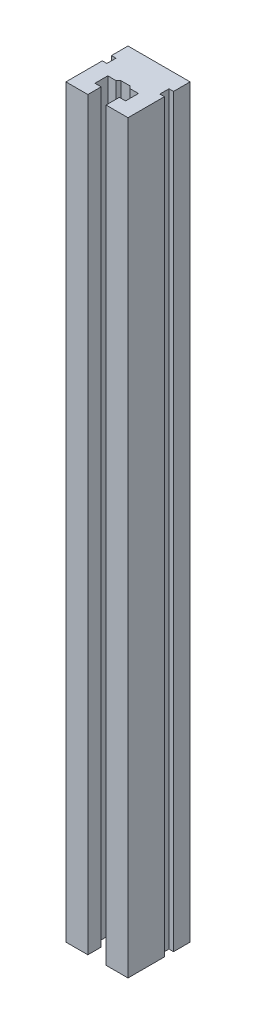
ISO-10303-21;
HEADER;
FILE_DESCRIPTION(('STEP AP214'),'2;1');
FILE_NAME('part.step','',(''),(''),'','','');
FILE_SCHEMA(('AUTOMOTIVE_DESIGN { 1 0 10303 214 1 1 1 1 }'));
ENDSEC;
DATA;
#1=APPLICATION_CONTEXT('core data for automotive mechanical design processes');
#2=APPLICATION_PROTOCOL_DEFINITION('international standard','automotive_design',2000,#1);
#3=PRODUCT_CONTEXT('',#1,'mechanical');
#4=PRODUCT('Part','Part','',(#3));
#5=PRODUCT_RELATED_PRODUCT_CATEGORY('part','',(#4));
#6=PRODUCT_DEFINITION_FORMATION('','',#4);
#7=PRODUCT_DEFINITION_CONTEXT('part definition',#1,'design');
#8=PRODUCT_DEFINITION('design','',#6,#7);
#9=PRODUCT_DEFINITION_SHAPE('','',#8);
#10=(LENGTH_UNIT() NAMED_UNIT(*) SI_UNIT(.MILLI.,.METRE.));
#11=(NAMED_UNIT(*) PLANE_ANGLE_UNIT() SI_UNIT($,.RADIAN.));
#12=(NAMED_UNIT(*) SI_UNIT($,.STERADIAN.) SOLID_ANGLE_UNIT());
#13=UNCERTAINTY_MEASURE_WITH_UNIT(LENGTH_MEASURE(1.E-05),#10,'distance_accuracy_value','');
#14=(GEOMETRIC_REPRESENTATION_CONTEXT(3) GLOBAL_UNCERTAINTY_ASSIGNED_CONTEXT((#13)) GLOBAL_UNIT_ASSIGNED_CONTEXT((#10,
#11,#12)) REPRESENTATION_CONTEXT('',''));
#15=CARTESIAN_POINT('',(0.,0.,0.));
#16=DIRECTION('',(0.,0.,1.));
#17=DIRECTION('',(1.,0.,0.));
#18=AXIS2_PLACEMENT_3D('',#15,#16,#17);
#19=CARTESIAN_POINT('',(37.5,-900.,19.9999999999997));
#20=DIRECTION('',(1.,0.,0.));
#21=DIRECTION('',(0.,0.,-1.));
#22=AXIS2_PLACEMENT_3D('',#19,#20,#21);
#23=PLANE('',#22);
#24=DIRECTION('',(0.,0.,-1.));
#25=VECTOR('',#24,1.);
#26=CARTESIAN_POINT('',(37.5,0.,19.9999999999997));
#27=LINE('',#26,#25);
#28=CARTESIAN_POINT('',(37.5,0.,19.9999999999997));
#29=VERTEX_POINT('',#28);
#30=CARTESIAN_POINT('',(37.5,0.,-2.97641118013882E-13));
#31=VERTEX_POINT('',#30);
#32=EDGE_CURVE('E244',#29,#31,#27,.T.);
#33=ORIENTED_EDGE('',*,*,#32,.F.);
#34=DIRECTION('',(0.,1.,0.));
#35=VECTOR('',#34,1.);
#36=CARTESIAN_POINT('',(37.5,-900.,19.9999999999997));
#37=LINE('',#36,#35);
#38=CARTESIAN_POINT('',(37.5,-900.,19.9999999999997));
#39=VERTEX_POINT('',#38);
#40=EDGE_CURVE('E11',#39,#29,#37,.T.);
#41=ORIENTED_EDGE('',*,*,#40,.F.);
#42=DIRECTION('',(0.,0.,-1.));
#43=VECTOR('',#42,1.);
#44=CARTESIAN_POINT('',(37.5,-900.,19.9999999999997));
#45=LINE('',#44,#43);
#46=CARTESIAN_POINT('',(37.5,-900.,-2.97641118013882E-13));
#47=VERTEX_POINT('',#46);
#48=EDGE_CURVE('E320',#39,#47,#45,.T.);
#49=ORIENTED_EDGE('',*,*,#48,.T.);
#50=DIRECTION('',(0.,1.,0.));
#51=VECTOR('',#50,1.);
#52=CARTESIAN_POINT('',(37.5,-900.,-2.97641118013882E-13));
#53=LINE('',#52,#51);
#54=EDGE_CURVE('E45',#47,#31,#53,.T.);
#55=ORIENTED_EDGE('',*,*,#54,.T.);
#56=EDGE_LOOP('',(#33,#41,#49,#55));
#57=FACE_BOUND('',#56,.T.);
#58=ADVANCED_FACE('F42',(#57),#23,.T.);
#59=CARTESIAN_POINT('',(32.,-900.,19.9999999999997));
#60=DIRECTION('',(0.,0.,1.));
#61=DIRECTION('',(1.,0.,0.));
#62=AXIS2_PLACEMENT_3D('',#59,#60,#61);
#63=PLANE('',#62);
#64=DIRECTION('',(1.,0.,0.));
#65=VECTOR('',#64,1.);
#66=CARTESIAN_POINT('',(32.,0.,19.9999999999997));
#67=LINE('',#66,#65);
#68=CARTESIAN_POINT('',(32.,0.,19.9999999999997));
#69=VERTEX_POINT('',#68);
#70=EDGE_CURVE('E318',#69,#29,#67,.T.);
#71=ORIENTED_EDGE('',*,*,#70,.F.);
#72=DIRECTION('',(0.,1.,0.));
#73=VECTOR('',#72,1.);
#74=CARTESIAN_POINT('',(32.,-900.,19.9999999999997));
#75=LINE('',#74,#73);
#76=CARTESIAN_POINT('',(32.,-900.,19.9999999999997));
#77=VERTEX_POINT('',#76);
#78=EDGE_CURVE('E52',#77,#69,#75,.T.);
#79=ORIENTED_EDGE('',*,*,#78,.F.);
#80=DIRECTION('',(1.,0.,0.));
#81=VECTOR('',#80,1.);
#82=CARTESIAN_POINT('',(32.,-900.,19.9999999999997));
#83=LINE('',#82,#81);
#84=EDGE_CURVE('E234',#77,#39,#83,.T.);
#85=ORIENTED_EDGE('',*,*,#84,.T.);
#86=ORIENTED_EDGE('',*,*,#40,.T.);
#87=EDGE_LOOP('',(#71,#79,#85,#86));
#88=FACE_BOUND('',#87,.T.);
#89=ADVANCED_FACE('F386',(#88),#63,.T.);
#90=CARTESIAN_POINT('',(32.,-900.,30.9999999999997));
#91=DIRECTION('',(1.,0.,0.));
#92=DIRECTION('',(0.,0.,-1.));
#93=AXIS2_PLACEMENT_3D('',#90,#91,#92);
#94=PLANE('',#93);
#95=DIRECTION('',(0.,0.,-1.));
#96=VECTOR('',#95,1.);
#97=CARTESIAN_POINT('',(32.,0.,30.9999999999997));
#98=LINE('',#97,#96);
#99=CARTESIAN_POINT('',(32.,0.,30.9999999999997));
#100=VERTEX_POINT('',#99);
#101=EDGE_CURVE('E220',#100,#69,#98,.T.);
#102=ORIENTED_EDGE('',*,*,#101,.F.);
#103=DIRECTION('',(0.,1.,0.));
#104=VECTOR('',#103,1.);
#105=CARTESIAN_POINT('',(32.,-900.,30.9999999999997));
#106=LINE('',#105,#104);
#107=CARTESIAN_POINT('',(32.,-900.,30.9999999999997));
#108=VERTEX_POINT('',#107);
#109=EDGE_CURVE('E215',#108,#100,#106,.T.);
#110=ORIENTED_EDGE('',*,*,#109,.F.);
#111=DIRECTION('',(0.,0.,-1.));
#112=VECTOR('',#111,1.);
#113=CARTESIAN_POINT('',(32.,-900.,30.9999999999997));
#114=LINE('',#113,#112);
#115=EDGE_CURVE('E218',#108,#77,#114,.T.);
#116=ORIENTED_EDGE('',*,*,#115,.T.);
#117=ORIENTED_EDGE('',*,*,#78,.T.);
#118=EDGE_LOOP('',(#102,#110,#116,#117));
#119=FACE_BOUND('',#118,.T.);
#120=ADVANCED_FACE('F217',(#119),#94,.T.);
#121=CARTESIAN_POINT('',(37.5,-900.,30.9999999999997));
#122=DIRECTION('',(0.,0.,-1.));
#123=DIRECTION('',(-1.,0.,0.));
#124=AXIS2_PLACEMENT_3D('',#121,#122,#123);
#125=PLANE('',#124);
#126=DIRECTION('',(-1.,0.,0.));
#127=VECTOR('',#126,1.);
#128=CARTESIAN_POINT('',(37.5,0.,30.9999999999997));
#129=LINE('',#128,#127);
#130=CARTESIAN_POINT('',(37.5,0.,30.9999999999997));
#131=VERTEX_POINT('',#130);
#132=EDGE_CURVE('E315',#131,#100,#129,.T.);
#133=ORIENTED_EDGE('',*,*,#132,.F.);
#134=DIRECTION('',(0.,1.,0.));
#135=VECTOR('',#134,1.);
#136=CARTESIAN_POINT('',(37.5,-900.,30.9999999999997));
#137=LINE('',#136,#135);
#138=CARTESIAN_POINT('',(37.5,-900.,30.9999999999997));
#139=VERTEX_POINT('',#138);
#140=EDGE_CURVE('E226',#139,#131,#137,.T.);
#141=ORIENTED_EDGE('',*,*,#140,.F.);
#142=DIRECTION('',(-1.,0.,0.));
#143=VECTOR('',#142,1.);
#144=CARTESIAN_POINT('',(37.5,-900.,30.9999999999997));
#145=LINE('',#144,#143);
#146=EDGE_CURVE('E232',#139,#108,#145,.T.);
#147=ORIENTED_EDGE('',*,*,#146,.T.);
#148=ORIENTED_EDGE('',*,*,#109,.T.);
#149=EDGE_LOOP('',(#133,#141,#147,#148));
#150=FACE_BOUND('',#149,.T.);
#151=ADVANCED_FACE('F236',(#150),#125,.T.);
#152=CARTESIAN_POINT('',(37.5,-900.,74.9999999999997));
#153=DIRECTION('',(1.,0.,0.));
#154=DIRECTION('',(0.,0.,-1.));
#155=AXIS2_PLACEMENT_3D('',#152,#153,#154);
#156=PLANE('',#155);
#157=DIRECTION('',(0.,0.,-1.));
#158=VECTOR('',#157,1.);
#159=CARTESIAN_POINT('',(37.5,0.,74.9999999999997));
#160=LINE('',#159,#158);
#161=CARTESIAN_POINT('',(37.5,0.,74.9999999999997));
#162=VERTEX_POINT('',#161);
#163=EDGE_CURVE('E312',#162,#131,#160,.T.);
#164=ORIENTED_EDGE('',*,*,#163,.F.);
#165=DIRECTION('',(0.,1.,0.));
#166=VECTOR('',#165,1.);
#167=CARTESIAN_POINT('',(37.5,-900.,74.9999999999997));
#168=LINE('',#167,#166);
#169=CARTESIAN_POINT('',(37.5,-900.,74.9999999999997));
#170=VERTEX_POINT('',#169);
#171=EDGE_CURVE('E326',#170,#162,#168,.T.);
#172=ORIENTED_EDGE('',*,*,#171,.F.);
#173=DIRECTION('',(0.,0.,-1.));
#174=VECTOR('',#173,1.);
#175=CARTESIAN_POINT('',(37.5,-900.,74.9999999999997));
#176=LINE('',#175,#174);
#177=EDGE_CURVE('E237',#170,#139,#176,.T.);
#178=ORIENTED_EDGE('',*,*,#177,.T.);
#179=ORIENTED_EDGE('',*,*,#140,.T.);
#180=EDGE_LOOP('',(#164,#172,#178,#179));
#181=FACE_BOUND('',#180,.T.);
#182=ADVANCED_FACE('F399',(#181),#156,.T.);
#183=CARTESIAN_POINT('',(11.,-900.,74.9999999999999));
#184=DIRECTION('',(0.,0.,1.));
#185=DIRECTION('',(1.,0.,0.));
#186=AXIS2_PLACEMENT_3D('',#183,#184,#185);
#187=PLANE('',#186);
#188=DIRECTION('',(1.,0.,0.));
#189=VECTOR('',#188,1.);
#190=CARTESIAN_POINT('',(11.,0.,74.9999999999999));
#191=LINE('',#190,#189);
#192=CARTESIAN_POINT('',(11.,0.,74.9999999999999));
#193=VERTEX_POINT('',#192);
#194=EDGE_CURVE('E309',#193,#162,#191,.T.);
#195=ORIENTED_EDGE('',*,*,#194,.F.);
#196=DIRECTION('',(0.,1.,0.));
#197=VECTOR('',#196,1.);
#198=CARTESIAN_POINT('',(11.,-900.,74.9999999999999));
#199=LINE('',#198,#197);
#200=CARTESIAN_POINT('',(11.,-900.,74.9999999999999));
#201=VERTEX_POINT('',#200);
#202=EDGE_CURVE('E329',#201,#193,#199,.T.);
#203=ORIENTED_EDGE('',*,*,#202,.F.);
#204=DIRECTION('',(1.,0.,0.));
#205=VECTOR('',#204,1.);
#206=CARTESIAN_POINT('',(11.,-900.,74.9999999999999));
#207=LINE('',#206,#205);
#208=EDGE_CURVE('E239',#201,#170,#207,.T.);
#209=ORIENTED_EDGE('',*,*,#208,.T.);
#210=ORIENTED_EDGE('',*,*,#171,.T.);
#211=EDGE_LOOP('',(#195,#203,#209,#210));
#212=FACE_BOUND('',#211,.T.);
#213=ADVANCED_FACE('F402',(#212),#187,.T.);
#214=CARTESIAN_POINT('',(11.,-900.,58.8999999999999));
#215=DIRECTION('',(-1.,0.,0.));
#216=DIRECTION('',(0.,0.,1.));
#217=AXIS2_PLACEMENT_3D('',#214,#215,#216);
#218=PLANE('',#217);
#219=DIRECTION('',(0.,0.,1.));
#220=VECTOR('',#219,1.);
#221=CARTESIAN_POINT('',(11.,0.,58.8999999999999));
#222=LINE('',#221,#220);
#223=CARTESIAN_POINT('',(11.,0.,58.8999999999999));
#224=VERTEX_POINT('',#223);
#225=EDGE_CURVE('E306',#224,#193,#222,.T.);
#226=ORIENTED_EDGE('',*,*,#225,.F.);
#227=DIRECTION('',(0.,1.,0.));
#228=VECTOR('',#227,1.);
#229=CARTESIAN_POINT('',(11.,-900.,58.8999999999999));
#230=LINE('',#229,#228);
#231=CARTESIAN_POINT('',(11.,-900.,58.8999999999999));
#232=VERTEX_POINT('',#231);
#233=EDGE_CURVE('E332',#232,#224,#230,.T.);
#234=ORIENTED_EDGE('',*,*,#233,.F.);
#235=DIRECTION('',(0.,0.,1.));
#236=VECTOR('',#235,1.);
#237=CARTESIAN_POINT('',(11.,-900.,58.8999999999999));
#238=LINE('',#237,#236);
#239=EDGE_CURVE('E750',#232,#201,#238,.T.);
#240=ORIENTED_EDGE('',*,*,#239,.T.);
#241=ORIENTED_EDGE('',*,*,#202,.T.);
#242=EDGE_LOOP('',(#226,#234,#240,#241));
#243=FACE_BOUND('',#242,.T.);
#244=ADVANCED_FACE('F406',(#243),#218,.T.);
#245=CARTESIAN_POINT('',(18.5,-900.,58.8999999999998));
#246=DIRECTION('',(0.,0.,-1.));
#247=DIRECTION('',(-1.,0.,0.));
#248=AXIS2_PLACEMENT_3D('',#245,#246,#247);
#249=PLANE('',#248);
#250=DIRECTION('',(-1.,0.,0.));
#251=VECTOR('',#250,1.);
#252=CARTESIAN_POINT('',(18.5,0.,58.8999999999998));
#253=LINE('',#252,#251);
#254=CARTESIAN_POINT('',(18.5,0.,58.8999999999998));
#255=VERTEX_POINT('',#254);
#256=EDGE_CURVE('E303',#255,#224,#253,.T.);
#257=ORIENTED_EDGE('',*,*,#256,.F.);
#258=DIRECTION('',(0.,1.,0.));
#259=VECTOR('',#258,1.);
#260=CARTESIAN_POINT('',(18.5,-900.,58.8999999999998));
#261=LINE('',#260,#259);
#262=CARTESIAN_POINT('',(18.5,-900.,58.8999999999998));
#263=VERTEX_POINT('',#262);
#264=EDGE_CURVE('E335',#263,#255,#261,.T.);
#265=ORIENTED_EDGE('',*,*,#264,.F.);
#266=DIRECTION('',(-1.,0.,0.));
#267=VECTOR('',#266,1.);
#268=CARTESIAN_POINT('',(18.5,-900.,58.8999999999998));
#269=LINE('',#268,#267);
#270=EDGE_CURVE('E754',#263,#232,#269,.T.);
#271=ORIENTED_EDGE('',*,*,#270,.T.);
#272=ORIENTED_EDGE('',*,*,#233,.T.);
#273=EDGE_LOOP('',(#257,#265,#271,#272));
#274=FACE_BOUND('',#273,.T.);
#275=ADVANCED_FACE('F410',(#274),#249,.T.);
#276=CARTESIAN_POINT('',(18.5,-900.,43.3999999999998));
#277=DIRECTION('',(-1.,0.,0.));
#278=DIRECTION('',(0.,0.,1.));
#279=AXIS2_PLACEMENT_3D('',#276,#277,#278);
#280=PLANE('',#279);
#281=DIRECTION('',(0.,0.,1.));
#282=VECTOR('',#281,1.);
#283=CARTESIAN_POINT('',(18.5,0.,43.3999999999998));
#284=LINE('',#283,#282);
#285=CARTESIAN_POINT('',(18.5,0.,43.3999999999998));
#286=VERTEX_POINT('',#285);
#287=EDGE_CURVE('E300',#286,#255,#284,.T.);
#288=ORIENTED_EDGE('',*,*,#287,.F.);
#289=DIRECTION('',(0.,1.,0.));
#290=VECTOR('',#289,1.);
#291=CARTESIAN_POINT('',(18.5,-900.,43.3999999999998));
#292=LINE('',#291,#290);
#293=CARTESIAN_POINT('',(18.5,-900.,43.3999999999998));
#294=VERTEX_POINT('',#293);
#295=EDGE_CURVE('E338',#294,#286,#292,.T.);
#296=ORIENTED_EDGE('',*,*,#295,.F.);
#297=DIRECTION('',(0.,0.,1.));
#298=VECTOR('',#297,1.);
#299=CARTESIAN_POINT('',(18.5,-900.,43.3999999999998));
#300=LINE('',#299,#298);
#301=EDGE_CURVE('E743',#294,#263,#300,.T.);
#302=ORIENTED_EDGE('',*,*,#301,.T.);
#303=ORIENTED_EDGE('',*,*,#264,.T.);
#304=EDGE_LOOP('',(#288,#296,#302,#303));
#305=FACE_BOUND('',#304,.T.);
#306=ADVANCED_FACE('F414',(#305),#280,.T.);
#307=CARTESIAN_POINT('',(8.39999999999985,-900.,43.3999999999999));
#308=DIRECTION('',(0.,0.,1.));
#309=DIRECTION('',(1.,0.,0.));
#310=AXIS2_PLACEMENT_3D('',#307,#308,#309);
#311=PLANE('',#310);
#312=DIRECTION('',(1.,0.,0.));
#313=VECTOR('',#312,1.);
#314=CARTESIAN_POINT('',(8.39999999999985,0.,43.3999999999999));
#315=LINE('',#314,#313);
#316=CARTESIAN_POINT('',(8.39999999999985,0.,43.3999999999999));
#317=VERTEX_POINT('',#316);
#318=EDGE_CURVE('E297',#317,#286,#315,.T.);
#319=ORIENTED_EDGE('',*,*,#318,.F.);
#320=DIRECTION('',(0.,1.,0.));
#321=VECTOR('',#320,1.);
#322=CARTESIAN_POINT('',(8.39999999999985,-900.,43.3999999999999));
#323=LINE('',#322,#321);
#324=CARTESIAN_POINT('',(8.39999999999985,-900.,43.3999999999999));
#325=VERTEX_POINT('',#324);
#326=EDGE_CURVE('E341',#325,#317,#323,.T.);
#327=ORIENTED_EDGE('',*,*,#326,.F.);
#328=DIRECTION('',(1.,0.,0.));
#329=VECTOR('',#328,1.);
#330=CARTESIAN_POINT('',(8.39999999999985,-900.,43.3999999999999));
#331=LINE('',#330,#329);
#332=EDGE_CURVE('E739',#325,#294,#331,.T.);
#333=ORIENTED_EDGE('',*,*,#332,.T.);
#334=ORIENTED_EDGE('',*,*,#295,.T.);
#335=EDGE_LOOP('',(#319,#327,#333,#334));
#336=FACE_BOUND('',#335,.T.);
#337=ADVANCED_FACE('F418',(#336),#311,.T.);
#338=CARTESIAN_POINT('',(8.39999999999985,-900.,43.3999999999999));
#339=DIRECTION('',(-0.707106781186559,0.,0.707106781186536));
#340=DIRECTION('',(0.707106781186536,0.,0.707106781186559));
#341=AXIS2_PLACEMENT_3D('',#338,#339,#340);
#342=PLANE('',#341);
#343=DIRECTION('',(0.707106781186536,0.,0.707106781186559));
#344=VECTOR('',#343,1.);
#345=CARTESIAN_POINT('',(8.39999999999985,0.,43.3999999999999));
#346=LINE('',#345,#344);
#347=CARTESIAN_POINT('',(5.49999999999997,0.,40.5));
#348=VERTEX_POINT('',#347);
#349=EDGE_CURVE('E294',#348,#317,#346,.T.);
#350=ORIENTED_EDGE('',*,*,#349,.F.);
#351=DIRECTION('',(0.,1.,0.));
#352=VECTOR('',#351,1.);
#353=CARTESIAN_POINT('',(5.49999999999997,-900.,40.5));
#354=LINE('',#353,#352);
#355=CARTESIAN_POINT('',(5.49999999999997,-900.,40.5));
#356=VERTEX_POINT('',#355);
#357=EDGE_CURVE('E344',#356,#348,#354,.T.);
#358=ORIENTED_EDGE('',*,*,#357,.F.);
#359=DIRECTION('',(0.707106781186536,0.,0.707106781186559));
#360=VECTOR('',#359,1.);
#361=CARTESIAN_POINT('',(8.39999999999985,-900.,43.3999999999999));
#362=LINE('',#361,#360);
#363=EDGE_CURVE('E760',#356,#325,#362,.T.);
#364=ORIENTED_EDGE('',*,*,#363,.T.);
#365=ORIENTED_EDGE('',*,*,#326,.T.);
#366=EDGE_LOOP('',(#350,#358,#364,#365));
#367=FACE_BOUND('',#366,.T.);
#368=ADVANCED_FACE('F422',(#367),#342,.T.);
#369=CARTESIAN_POINT('',(5.49999999999997,-900.,40.5));
#370=DIRECTION('',(0.,0.,1.));
#371=DIRECTION('',(1.,0.,0.));
#372=AXIS2_PLACEMENT_3D('',#369,#370,#371);
#373=PLANE('',#372);
#374=DIRECTION('',(1.,0.,0.));
#375=VECTOR('',#374,1.);
#376=CARTESIAN_POINT('',(5.49999999999997,0.,40.5));
#377=LINE('',#376,#375);
#378=CARTESIAN_POINT('',(-5.50000000000003,0.,40.5));
#379=VERTEX_POINT('',#378);
#380=EDGE_CURVE('E291',#379,#348,#377,.T.);
#381=ORIENTED_EDGE('',*,*,#380,.F.);
#382=DIRECTION('',(0.,1.,0.));
#383=VECTOR('',#382,1.);
#384=CARTESIAN_POINT('',(-5.50000000000003,-900.,40.5));
#385=LINE('',#384,#383);
#386=CARTESIAN_POINT('',(-5.50000000000003,-900.,40.5));
#387=VERTEX_POINT('',#386);
#388=EDGE_CURVE('E347',#387,#379,#385,.T.);
#389=ORIENTED_EDGE('',*,*,#388,.F.);
#390=DIRECTION('',(1.,0.,0.));
#391=VECTOR('',#390,1.);
#392=CARTESIAN_POINT('',(5.49999999999997,-900.,40.5));
#393=LINE('',#392,#391);
#394=EDGE_CURVE('E732',#387,#356,#393,.T.);
#395=ORIENTED_EDGE('',*,*,#394,.T.);
#396=ORIENTED_EDGE('',*,*,#357,.T.);
#397=EDGE_LOOP('',(#381,#389,#395,#396));
#398=FACE_BOUND('',#397,.T.);
#399=ADVANCED_FACE('F426',(#398),#373,.T.);
#400=CARTESIAN_POINT('',(-5.50000000000003,-900.,40.5));
#401=DIRECTION('',(0.707106781186559,0.,0.707106781186536));
#402=DIRECTION('',(0.707106781186536,0.,-0.707106781186559));
#403=AXIS2_PLACEMENT_3D('',#400,#401,#402);
#404=PLANE('',#403);
#405=DIRECTION('',(0.707106781186535,0.,-0.707106781186559));
#406=VECTOR('',#405,1.);
#407=CARTESIAN_POINT('',(-5.50000000000003,0.,40.5));
#408=LINE('',#407,#406);
#409=CARTESIAN_POINT('',(-8.39999999999996,0.,43.4000000000001));
#410=VERTEX_POINT('',#409);
#411=EDGE_CURVE('E288',#410,#379,#408,.T.);
#412=ORIENTED_EDGE('',*,*,#411,.F.);
#413=DIRECTION('',(0.,1.,0.));
#414=VECTOR('',#413,1.);
#415=CARTESIAN_POINT('',(-8.39999999999996,-900.,43.4000000000001));
#416=LINE('',#415,#414);
#417=CARTESIAN_POINT('',(-8.39999999999996,-900.,43.4000000000001));
#418=VERTEX_POINT('',#417);
#419=EDGE_CURVE('E350',#418,#410,#416,.T.);
#420=ORIENTED_EDGE('',*,*,#419,.F.);
#421=DIRECTION('',(0.707106781186535,0.,-0.707106781186559));
#422=VECTOR('',#421,1.);
#423=CARTESIAN_POINT('',(-5.50000000000003,-900.,40.5));
#424=LINE('',#423,#422);
#425=EDGE_CURVE('E728',#418,#387,#424,.T.);
#426=ORIENTED_EDGE('',*,*,#425,.T.);
#427=ORIENTED_EDGE('',*,*,#388,.T.);
#428=EDGE_LOOP('',(#412,#420,#426,#427));
#429=FACE_BOUND('',#428,.T.);
#430=ADVANCED_FACE('F430',(#429),#404,.T.);
#431=CARTESIAN_POINT('',(-18.5,-900.,43.4000000000001));
#432=DIRECTION('',(0.,0.,1.));
#433=DIRECTION('',(1.,0.,0.));
#434=AXIS2_PLACEMENT_3D('',#431,#432,#433);
#435=PLANE('',#434);
#436=DIRECTION('',(1.,0.,0.));
#437=VECTOR('',#436,1.);
#438=CARTESIAN_POINT('',(-18.5,0.,43.4000000000001));
#439=LINE('',#438,#437);
#440=CARTESIAN_POINT('',(-18.5,0.,43.4000000000001));
#441=VERTEX_POINT('',#440);
#442=EDGE_CURVE('E285',#441,#410,#439,.T.);
#443=ORIENTED_EDGE('',*,*,#442,.F.);
#444=DIRECTION('',(0.,1.,0.));
#445=VECTOR('',#444,1.);
#446=CARTESIAN_POINT('',(-18.5,-900.,43.4000000000001));
#447=LINE('',#446,#445);
#448=CARTESIAN_POINT('',(-18.5,-900.,43.4000000000001));
#449=VERTEX_POINT('',#448);
#450=EDGE_CURVE('E353',#449,#441,#447,.T.);
#451=ORIENTED_EDGE('',*,*,#450,.F.);
#452=DIRECTION('',(1.,0.,0.));
#453=VECTOR('',#452,1.);
#454=CARTESIAN_POINT('',(-18.5,-900.,43.4000000000001));
#455=LINE('',#454,#453);
#456=EDGE_CURVE('E764',#449,#418,#455,.T.);
#457=ORIENTED_EDGE('',*,*,#456,.T.);
#458=ORIENTED_EDGE('',*,*,#419,.T.);
#459=EDGE_LOOP('',(#443,#451,#457,#458));
#460=FACE_BOUND('',#459,.T.);
#461=ADVANCED_FACE('F434',(#460),#435,.T.);
#462=CARTESIAN_POINT('',(-18.5,-900.,58.9000000000001));
#463=DIRECTION('',(1.,0.,0.));
#464=DIRECTION('',(0.,0.,-1.));
#465=AXIS2_PLACEMENT_3D('',#462,#463,#464);
#466=PLANE('',#465);
#467=DIRECTION('',(0.,0.,-1.));
#468=VECTOR('',#467,1.);
#469=CARTESIAN_POINT('',(-18.5,0.,58.9000000000001));
#470=LINE('',#469,#468);
#471=CARTESIAN_POINT('',(-18.5,0.,58.9000000000001));
#472=VERTEX_POINT('',#471);
#473=EDGE_CURVE('E282',#472,#441,#470,.T.);
#474=ORIENTED_EDGE('',*,*,#473,.F.);
#475=DIRECTION('',(0.,1.,0.));
#476=VECTOR('',#475,1.);
#477=CARTESIAN_POINT('',(-18.5,-900.,58.9000000000001));
#478=LINE('',#477,#476);
#479=CARTESIAN_POINT('',(-18.5,-900.,58.9000000000001));
#480=VERTEX_POINT('',#479);
#481=EDGE_CURVE('E356',#480,#472,#478,.T.);
#482=ORIENTED_EDGE('',*,*,#481,.F.);
#483=DIRECTION('',(0.,0.,-1.));
#484=VECTOR('',#483,1.);
#485=CARTESIAN_POINT('',(-18.5,-900.,58.9000000000001));
#486=LINE('',#485,#484);
#487=EDGE_CURVE('E721',#480,#449,#486,.T.);
#488=ORIENTED_EDGE('',*,*,#487,.T.);
#489=ORIENTED_EDGE('',*,*,#450,.T.);
#490=EDGE_LOOP('',(#474,#482,#488,#489));
#491=FACE_BOUND('',#490,.T.);
#492=ADVANCED_FACE('F438',(#491),#466,.T.);
#493=CARTESIAN_POINT('',(-11.,-900.,58.9000000000001));
#494=DIRECTION('',(0.,0.,-1.));
#495=DIRECTION('',(-1.,0.,0.));
#496=AXIS2_PLACEMENT_3D('',#493,#494,#495);
#497=PLANE('',#496);
#498=DIRECTION('',(-1.,0.,0.));
#499=VECTOR('',#498,1.);
#500=CARTESIAN_POINT('',(-11.,0.,58.9000000000001));
#501=LINE('',#500,#499);
#502=CARTESIAN_POINT('',(-11.,0.,58.9000000000001));
#503=VERTEX_POINT('',#502);
#504=EDGE_CURVE('E279',#503,#472,#501,.T.);
#505=ORIENTED_EDGE('',*,*,#504,.F.);
#506=DIRECTION('',(0.,1.,0.));
#507=VECTOR('',#506,1.);
#508=CARTESIAN_POINT('',(-11.,-900.,58.9000000000001));
#509=LINE('',#508,#507);
#510=CARTESIAN_POINT('',(-11.,-900.,58.9000000000001));
#511=VERTEX_POINT('',#510);
#512=EDGE_CURVE('E359',#511,#503,#509,.T.);
#513=ORIENTED_EDGE('',*,*,#512,.F.);
#514=DIRECTION('',(-1.,0.,0.));
#515=VECTOR('',#514,1.);
#516=CARTESIAN_POINT('',(-11.,-900.,58.9000000000001));
#517=LINE('',#516,#515);
#518=EDGE_CURVE('E717',#511,#480,#517,.T.);
#519=ORIENTED_EDGE('',*,*,#518,.T.);
#520=ORIENTED_EDGE('',*,*,#481,.T.);
#521=EDGE_LOOP('',(#505,#513,#519,#520));
#522=FACE_BOUND('',#521,.T.);
#523=ADVANCED_FACE('F442',(#522),#497,.T.);
#524=CARTESIAN_POINT('',(-11.,-900.,75.0000000000001));
#525=DIRECTION('',(1.,0.,0.));
#526=DIRECTION('',(0.,0.,-1.));
#527=AXIS2_PLACEMENT_3D('',#524,#525,#526);
#528=PLANE('',#527);
#529=DIRECTION('',(0.,0.,-1.));
#530=VECTOR('',#529,1.);
#531=CARTESIAN_POINT('',(-11.,0.,75.0000000000001));
#532=LINE('',#531,#530);
#533=CARTESIAN_POINT('',(-11.,0.,75.0000000000001));
#534=VERTEX_POINT('',#533);
#535=EDGE_CURVE('E276',#534,#503,#532,.T.);
#536=ORIENTED_EDGE('',*,*,#535,.F.);
#537=DIRECTION('',(0.,1.,0.));
#538=VECTOR('',#537,1.);
#539=CARTESIAN_POINT('',(-11.,-900.,75.0000000000001));
#540=LINE('',#539,#538);
#541=CARTESIAN_POINT('',(-11.,-900.,75.0000000000001));
#542=VERTEX_POINT('',#541);
#543=EDGE_CURVE('E362',#542,#534,#540,.T.);
#544=ORIENTED_EDGE('',*,*,#543,.F.);
#545=DIRECTION('',(0.,0.,-1.));
#546=VECTOR('',#545,1.);
#547=CARTESIAN_POINT('',(-11.,-900.,75.0000000000001));
#548=LINE('',#547,#546);
#549=EDGE_CURVE('E768',#542,#511,#548,.T.);
#550=ORIENTED_EDGE('',*,*,#549,.T.);
#551=ORIENTED_EDGE('',*,*,#512,.T.);
#552=EDGE_LOOP('',(#536,#544,#550,#551));
#553=FACE_BOUND('',#552,.T.);
#554=ADVANCED_FACE('F446',(#553),#528,.T.);
#555=CARTESIAN_POINT('',(-37.5,-900.,75.0000000000003));
#556=DIRECTION('',(0.,0.,1.));
#557=DIRECTION('',(1.,0.,0.));
#558=AXIS2_PLACEMENT_3D('',#555,#556,#557);
#559=PLANE('',#558);
#560=DIRECTION('',(1.,0.,0.));
#561=VECTOR('',#560,1.);
#562=CARTESIAN_POINT('',(-37.5,0.,75.0000000000003));
#563=LINE('',#562,#561);
#564=CARTESIAN_POINT('',(-37.5,0.,75.0000000000003));
#565=VERTEX_POINT('',#564);
#566=EDGE_CURVE('E272',#565,#534,#563,.T.);
#567=ORIENTED_EDGE('',*,*,#566,.F.);
#568=DIRECTION('',(0.,1.,0.));
#569=VECTOR('',#568,1.);
#570=CARTESIAN_POINT('',(-37.5,-900.,75.0000000000003));
#571=LINE('',#570,#569);
#572=CARTESIAN_POINT('',(-37.5,-900.,75.0000000000003));
#573=VERTEX_POINT('',#572);
#574=EDGE_CURVE('E365',#573,#565,#571,.T.);
#575=ORIENTED_EDGE('',*,*,#574,.F.);
#576=DIRECTION('',(1.,0.,0.));
#577=VECTOR('',#576,1.);
#578=CARTESIAN_POINT('',(-37.5,-900.,75.0000000000003));
#579=LINE('',#578,#577);
#580=EDGE_CURVE('E710',#573,#542,#579,.T.);
#581=ORIENTED_EDGE('',*,*,#580,.T.);
#582=ORIENTED_EDGE('',*,*,#543,.T.);
#583=EDGE_LOOP('',(#567,#575,#581,#582));
#584=FACE_BOUND('',#583,.T.);
#585=ADVANCED_FACE('F450',(#584),#559,.T.);
#586=CARTESIAN_POINT('',(-37.5,-900.,31.0000000000003));
#587=DIRECTION('',(-1.,0.,0.));
#588=DIRECTION('',(0.,0.,1.));
#589=AXIS2_PLACEMENT_3D('',#586,#587,#588);
#590=PLANE('',#589);
#591=DIRECTION('',(0.,0.,1.));
#592=VECTOR('',#591,1.);
#593=CARTESIAN_POINT('',(-37.5,0.,31.0000000000003));
#594=LINE('',#593,#592);
#595=CARTESIAN_POINT('',(-37.5,0.,31.0000000000003));
#596=VERTEX_POINT('',#595);
#597=EDGE_CURVE('E268',#596,#565,#594,.T.);
#598=ORIENTED_EDGE('',*,*,#597,.F.);
#599=DIRECTION('',(0.,1.,0.));
#600=VECTOR('',#599,1.);
#601=CARTESIAN_POINT('',(-37.5,-900.,31.0000000000003));
#602=LINE('',#601,#600);
#603=CARTESIAN_POINT('',(-37.5,-900.,31.0000000000003));
#604=VERTEX_POINT('',#603);
#605=EDGE_CURVE('E368',#604,#596,#602,.T.);
#606=ORIENTED_EDGE('',*,*,#605,.F.);
#607=DIRECTION('',(0.,0.,1.));
#608=VECTOR('',#607,1.);
#609=CARTESIAN_POINT('',(-37.5,-900.,31.0000000000003));
#610=LINE('',#609,#608);
#611=EDGE_CURVE('E706',#604,#573,#610,.T.);
#612=ORIENTED_EDGE('',*,*,#611,.T.);
#613=ORIENTED_EDGE('',*,*,#574,.T.);
#614=EDGE_LOOP('',(#598,#606,#612,#613));
#615=FACE_BOUND('',#614,.T.);
#616=ADVANCED_FACE('F454',(#615),#590,.T.);
#617=CARTESIAN_POINT('',(-32.,-900.,31.0000000000003));
#618=DIRECTION('',(0.,0.,-1.));
#619=DIRECTION('',(-1.,0.,0.));
#620=AXIS2_PLACEMENT_3D('',#617,#618,#619);
#621=PLANE('',#620);
#622=DIRECTION('',(-1.,0.,0.));
#623=VECTOR('',#622,1.);
#624=CARTESIAN_POINT('',(-32.,0.,31.0000000000003));
#625=LINE('',#624,#623);
#626=CARTESIAN_POINT('',(-32.,0.,31.0000000000003));
#627=VERTEX_POINT('',#626);
#628=EDGE_CURVE('E264',#627,#596,#625,.T.);
#629=ORIENTED_EDGE('',*,*,#628,.F.);
#630=DIRECTION('',(0.,1.,0.));
#631=VECTOR('',#630,1.);
#632=CARTESIAN_POINT('',(-32.,-900.,31.0000000000003));
#633=LINE('',#632,#631);
#634=CARTESIAN_POINT('',(-32.,-900.,31.0000000000003));
#635=VERTEX_POINT('',#634);
#636=EDGE_CURVE('E371',#635,#627,#633,.T.);
#637=ORIENTED_EDGE('',*,*,#636,.F.);
#638=DIRECTION('',(-1.,0.,0.));
#639=VECTOR('',#638,1.);
#640=CARTESIAN_POINT('',(-32.,-900.,31.0000000000003));
#641=LINE('',#640,#639);
#642=EDGE_CURVE('E772',#635,#604,#641,.T.);
#643=ORIENTED_EDGE('',*,*,#642,.T.);
#644=ORIENTED_EDGE('',*,*,#605,.T.);
#645=EDGE_LOOP('',(#629,#637,#643,#644));
#646=FACE_BOUND('',#645,.T.);
#647=ADVANCED_FACE('F458',(#646),#621,.T.);
#648=CARTESIAN_POINT('',(-32.,-900.,20.0000000000003));
#649=DIRECTION('',(-1.,0.,0.));
#650=DIRECTION('',(0.,0.,1.));
#651=AXIS2_PLACEMENT_3D('',#648,#649,#650);
#652=PLANE('',#651);
#653=DIRECTION('',(0.,0.,1.));
#654=VECTOR('',#653,1.);
#655=CARTESIAN_POINT('',(-32.,0.,20.0000000000003));
#656=LINE('',#655,#654);
#657=CARTESIAN_POINT('',(-32.,0.,20.0000000000003));
#658=VERTEX_POINT('',#657);
#659=EDGE_CURVE('E260',#658,#627,#656,.T.);
#660=ORIENTED_EDGE('',*,*,#659,.F.);
#661=DIRECTION('',(0.,1.,0.));
#662=VECTOR('',#661,1.);
#663=CARTESIAN_POINT('',(-32.,-900.,20.0000000000003));
#664=LINE('',#663,#662);
#665=CARTESIAN_POINT('',(-32.,-900.,20.0000000000003));
#666=VERTEX_POINT('',#665);
#667=EDGE_CURVE('E374',#666,#658,#664,.T.);
#668=ORIENTED_EDGE('',*,*,#667,.F.);
#669=DIRECTION('',(0.,0.,1.));
#670=VECTOR('',#669,1.);
#671=CARTESIAN_POINT('',(-32.,-900.,20.0000000000003));
#672=LINE('',#671,#670);
#673=EDGE_CURVE('E699',#666,#635,#672,.T.);
#674=ORIENTED_EDGE('',*,*,#673,.T.);
#675=ORIENTED_EDGE('',*,*,#636,.T.);
#676=EDGE_LOOP('',(#660,#668,#674,#675));
#677=FACE_BOUND('',#676,.T.);
#678=ADVANCED_FACE('F462',(#677),#652,.T.);
#679=CARTESIAN_POINT('',(-37.5,-900.,20.0000000000003));
#680=DIRECTION('',(0.,0.,1.));
#681=DIRECTION('',(1.,0.,0.));
#682=AXIS2_PLACEMENT_3D('',#679,#680,#681);
#683=PLANE('',#682);
#684=DIRECTION('',(1.,0.,0.));
#685=VECTOR('',#684,1.);
#686=CARTESIAN_POINT('',(-37.5,0.,20.0000000000003));
#687=LINE('',#686,#685);
#688=CARTESIAN_POINT('',(-37.5,0.,20.0000000000003));
#689=VERTEX_POINT('',#688);
#690=EDGE_CURVE('E256',#689,#658,#687,.T.);
#691=ORIENTED_EDGE('',*,*,#690,.F.);
#692=DIRECTION('',(0.,1.,0.));
#693=VECTOR('',#692,1.);
#694=CARTESIAN_POINT('',(-37.5,-900.,20.0000000000003));
#695=LINE('',#694,#693);
#696=CARTESIAN_POINT('',(-37.5,-900.,20.0000000000003));
#697=VERTEX_POINT('',#696);
#698=EDGE_CURVE('E377',#697,#689,#695,.T.);
#699=ORIENTED_EDGE('',*,*,#698,.F.);
#700=DIRECTION('',(1.,0.,0.));
#701=VECTOR('',#700,1.);
#702=CARTESIAN_POINT('',(-37.5,-900.,20.0000000000003));
#703=LINE('',#702,#701);
#704=EDGE_CURVE('E695',#697,#666,#703,.T.);
#705=ORIENTED_EDGE('',*,*,#704,.T.);
#706=ORIENTED_EDGE('',*,*,#667,.T.);
#707=EDGE_LOOP('',(#691,#699,#705,#706));
#708=FACE_BOUND('',#707,.T.);
#709=ADVANCED_FACE('F466',(#708),#683,.T.);
#710=CARTESIAN_POINT('',(-37.5,-900.,3.02233543510684E-13));
#711=DIRECTION('',(-1.,0.,0.));
#712=DIRECTION('',(0.,0.,1.));
#713=AXIS2_PLACEMENT_3D('',#710,#711,#712);
#714=PLANE('',#713);
#715=DIRECTION('',(0.,0.,1.));
#716=VECTOR('',#715,1.);
#717=CARTESIAN_POINT('',(-37.5,0.,3.02233543510684E-13));
#718=LINE('',#717,#716);
#719=CARTESIAN_POINT('',(-37.5,0.,3.02233543510684E-13));
#720=VERTEX_POINT('',#719);
#721=EDGE_CURVE('E252',#720,#689,#718,.T.);
#722=ORIENTED_EDGE('',*,*,#721,.F.);
#723=DIRECTION('',(0.,1.,0.));
#724=VECTOR('',#723,1.);
#725=CARTESIAN_POINT('',(-37.5,-900.,3.02233543510684E-13));
#726=LINE('',#725,#724);
#727=CARTESIAN_POINT('',(-37.5,-900.,3.02233543510684E-13));
#728=VERTEX_POINT('',#727);
#729=EDGE_CURVE('E379',#728,#720,#726,.T.);
#730=ORIENTED_EDGE('',*,*,#729,.F.);
#731=DIRECTION('',(0.,0.,1.));
#732=VECTOR('',#731,1.);
#733=CARTESIAN_POINT('',(-37.5,-900.,3.02233543510684E-13));
#734=LINE('',#733,#732);
#735=EDGE_CURVE('E776',#728,#697,#734,.T.);
#736=ORIENTED_EDGE('',*,*,#735,.T.);
#737=ORIENTED_EDGE('',*,*,#698,.T.);
#738=EDGE_LOOP('',(#722,#730,#736,#737));
#739=FACE_BOUND('',#738,.T.);
#740=ADVANCED_FACE('F470',(#739),#714,.T.);
#741=CARTESIAN_POINT('',(37.5,-900.,-2.97641118013882E-13));
#742=DIRECTION('',(0.,0.,-1.));
#743=DIRECTION('',(-1.,0.,0.));
#744=AXIS2_PLACEMENT_3D('',#741,#742,#743);
#745=PLANE('',#744);
#746=DIRECTION('',(-1.,0.,0.));
#747=VECTOR('',#746,1.);
#748=CARTESIAN_POINT('',(37.5,0.,-2.97641118013882E-13));
#749=LINE('',#748,#747);
#750=EDGE_CURVE('E248',#31,#720,#749,.T.);
#751=ORIENTED_EDGE('',*,*,#750,.F.);
#752=ORIENTED_EDGE('',*,*,#54,.F.);
#753=DIRECTION('',(-1.,0.,0.));
#754=VECTOR('',#753,1.);
#755=CARTESIAN_POINT('',(37.5,-900.,-2.97641118013882E-13));
#756=LINE('',#755,#754);
#757=EDGE_CURVE('E779',#47,#728,#756,.T.);
#758=ORIENTED_EDGE('',*,*,#757,.T.);
#759=ORIENTED_EDGE('',*,*,#729,.T.);
#760=EDGE_LOOP('',(#751,#752,#758,#759));
#761=FACE_BOUND('',#760,.T.);
#762=ADVANCED_FACE('F383',(#761),#745,.T.);
#763=CARTESIAN_POINT('',(0.,-900.,0.));
#764=DIRECTION('',(0.,1.,0.));
#765=DIRECTION('',(0.,0.,1.));
#766=AXIS2_PLACEMENT_3D('',#763,#764,#765);
#767=PLANE('',#766);
#768=ORIENTED_EDGE('',*,*,#48,.F.);
#769=ORIENTED_EDGE('',*,*,#84,.F.);
#770=ORIENTED_EDGE('',*,*,#115,.F.);
#771=ORIENTED_EDGE('',*,*,#146,.F.);
#772=ORIENTED_EDGE('',*,*,#177,.F.);
#773=ORIENTED_EDGE('',*,*,#208,.F.);
#774=ORIENTED_EDGE('',*,*,#239,.F.);
#775=ORIENTED_EDGE('',*,*,#270,.F.);
#776=ORIENTED_EDGE('',*,*,#301,.F.);
#777=ORIENTED_EDGE('',*,*,#332,.F.);
#778=ORIENTED_EDGE('',*,*,#363,.F.);
#779=ORIENTED_EDGE('',*,*,#394,.F.);
#780=ORIENTED_EDGE('',*,*,#425,.F.);
#781=ORIENTED_EDGE('',*,*,#456,.F.);
#782=ORIENTED_EDGE('',*,*,#487,.F.);
#783=ORIENTED_EDGE('',*,*,#518,.F.);
#784=ORIENTED_EDGE('',*,*,#549,.F.);
#785=ORIENTED_EDGE('',*,*,#580,.F.);
#786=ORIENTED_EDGE('',*,*,#611,.F.);
#787=ORIENTED_EDGE('',*,*,#642,.F.);
#788=ORIENTED_EDGE('',*,*,#673,.F.);
#789=ORIENTED_EDGE('',*,*,#704,.F.);
#790=ORIENTED_EDGE('',*,*,#735,.F.);
#791=ORIENTED_EDGE('',*,*,#757,.F.);
#792=EDGE_LOOP('',(#768,#769,#770,#771,#772,#773,#774,#775,#776,#777,#778,#779,#780,#781,#782,
#783,#784,#785,#786,#787,#788,#789,#790,#791));
#793=FACE_BOUND('',#792,.T.);
#794=ADVANCED_FACE('F230',(#793),#767,.F.);
#795=CARTESIAN_POINT('',(0.,0.,0.));
#796=DIRECTION('',(0.,1.,0.));
#797=DIRECTION('',(0.,0.,1.));
#798=AXIS2_PLACEMENT_3D('',#795,#796,#797);
#799=PLANE('',#798);
#800=ORIENTED_EDGE('',*,*,#32,.T.);
#801=ORIENTED_EDGE('',*,*,#750,.T.);
#802=ORIENTED_EDGE('',*,*,#721,.T.);
#803=ORIENTED_EDGE('',*,*,#690,.T.);
#804=ORIENTED_EDGE('',*,*,#659,.T.);
#805=ORIENTED_EDGE('',*,*,#628,.T.);
#806=ORIENTED_EDGE('',*,*,#597,.T.);
#807=ORIENTED_EDGE('',*,*,#566,.T.);
#808=ORIENTED_EDGE('',*,*,#535,.T.);
#809=ORIENTED_EDGE('',*,*,#504,.T.);
#810=ORIENTED_EDGE('',*,*,#473,.T.);
#811=ORIENTED_EDGE('',*,*,#442,.T.);
#812=ORIENTED_EDGE('',*,*,#411,.T.);
#813=ORIENTED_EDGE('',*,*,#380,.T.);
#814=ORIENTED_EDGE('',*,*,#349,.T.);
#815=ORIENTED_EDGE('',*,*,#318,.T.);
#816=ORIENTED_EDGE('',*,*,#287,.T.);
#817=ORIENTED_EDGE('',*,*,#256,.T.);
#818=ORIENTED_EDGE('',*,*,#225,.T.);
#819=ORIENTED_EDGE('',*,*,#194,.T.);
#820=ORIENTED_EDGE('',*,*,#163,.T.);
#821=ORIENTED_EDGE('',*,*,#132,.T.);
#822=ORIENTED_EDGE('',*,*,#101,.T.);
#823=ORIENTED_EDGE('',*,*,#70,.T.);
#824=EDGE_LOOP('',(#800,#801,#802,#803,#804,#805,#806,#807,#808,#809,#810,#811,#812,#813,#814,
#815,#816,#817,#818,#819,#820,#821,#822,#823));
#825=FACE_BOUND('',#824,.T.);
#826=ADVANCED_FACE('F385',(#825),#799,.T.);
#827=CLOSED_SHELL('',(#58,#89,#120,#151,#182,#213,#244,#275,#306,#337,#368,#399,#430,#461,#492,
#523,#554,#585,#616,#647,#678,#709,#740,#762,#794,#826));
#828=MANIFOLD_SOLID_BREP('B2',#827);
#829=ADVANCED_BREP_SHAPE_REPRESENTATION('',(#18,#828),#14);
#830=SHAPE_DEFINITION_REPRESENTATION(#9,#829);
ENDSEC;
END-ISO-10303-21;
